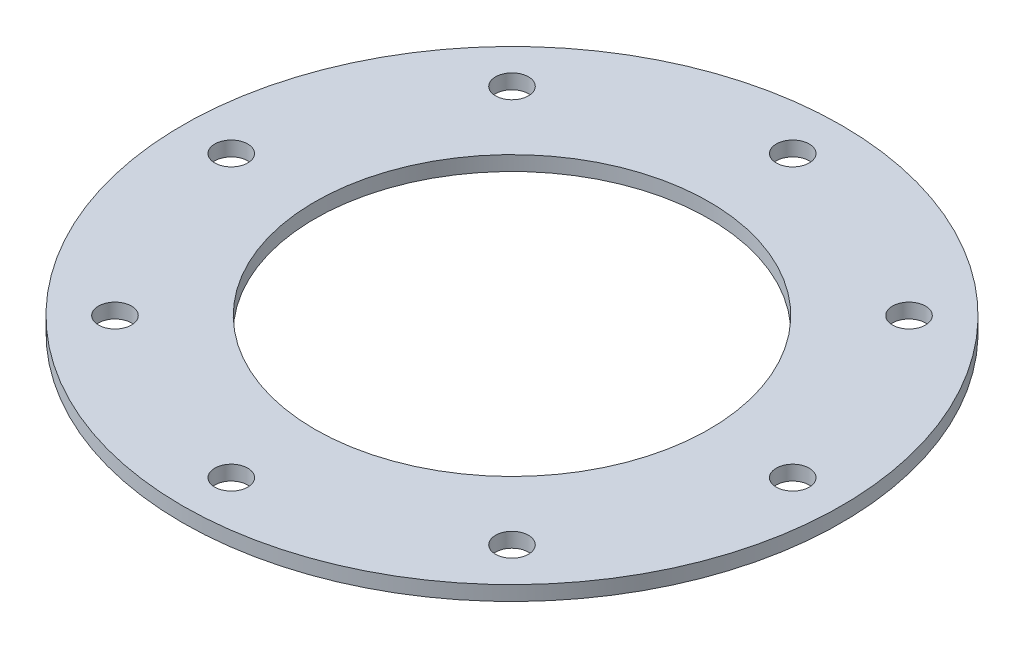
ISO-10303-21;
HEADER;
FILE_DESCRIPTION(('STEP AP214'),'2;1');
FILE_NAME('part.step','',(''),(''),'','','');
FILE_SCHEMA(('AUTOMOTIVE_DESIGN { 1 0 10303 214 1 1 1 1 }'));
ENDSEC;
DATA;
#1=APPLICATION_CONTEXT('core data for automotive mechanical design processes');
#2=APPLICATION_PROTOCOL_DEFINITION('international standard','automotive_design',2000,#1);
#3=PRODUCT_CONTEXT('',#1,'mechanical');
#4=PRODUCT('Part','Part','',(#3));
#5=PRODUCT_RELATED_PRODUCT_CATEGORY('part','',(#4));
#6=PRODUCT_DEFINITION_FORMATION('','',#4);
#7=PRODUCT_DEFINITION_CONTEXT('part definition',#1,'design');
#8=PRODUCT_DEFINITION('design','',#6,#7);
#9=PRODUCT_DEFINITION_SHAPE('','',#8);
#10=(LENGTH_UNIT() NAMED_UNIT(*) SI_UNIT(.MILLI.,.METRE.));
#11=(NAMED_UNIT(*) PLANE_ANGLE_UNIT() SI_UNIT($,.RADIAN.));
#12=(NAMED_UNIT(*) SI_UNIT($,.STERADIAN.) SOLID_ANGLE_UNIT());
#13=UNCERTAINTY_MEASURE_WITH_UNIT(LENGTH_MEASURE(1.E-05),#10,'distance_accuracy_value','');
#14=(GEOMETRIC_REPRESENTATION_CONTEXT(3) GLOBAL_UNCERTAINTY_ASSIGNED_CONTEXT((#13)) GLOBAL_UNIT_ASSIGNED_CONTEXT((#10,
#11,#12)) REPRESENTATION_CONTEXT('',''));
#15=CARTESIAN_POINT('',(0.,0.,0.));
#16=DIRECTION('',(0.,0.,1.));
#17=DIRECTION('',(1.,0.,0.));
#18=AXIS2_PLACEMENT_3D('',#15,#16,#17);
#19=CARTESIAN_POINT('',(0.,6.,0.));
#20=DIRECTION('',(0.,1.,0.));
#21=DIRECTION('',(0.,0.,1.));
#22=AXIS2_PLACEMENT_3D('',#19,#20,#21);
#23=PLANE('',#22);
#24=CARTESIAN_POINT('',(0.,6.,-115.));
#25=DIRECTION('',(0.,1.,0.));
#26=DIRECTION('',(0.,0.,1.));
#27=AXIS2_PLACEMENT_3D('',#24,#25,#26);
#28=CIRCLE('',#27,6.75);
#29=CARTESIAN_POINT('',(0.,6.,-108.25));
#30=VERTEX_POINT('',#29);
#31=EDGE_CURVE('E100',#30,#30,#28,.T.);
#32=ORIENTED_EDGE('',*,*,#31,.F.);
#33=EDGE_LOOP('',(#32));
#34=FACE_BOUND('',#33,.T.);
#35=CARTESIAN_POINT('',(81.3172798364558,6.,-81.3172798364599));
#36=DIRECTION('',(0.,1.,0.));
#37=DIRECTION('',(0.,0.,1.));
#38=AXIS2_PLACEMENT_3D('',#35,#36,#37);
#39=CIRCLE('',#38,6.75000000000001);
#40=CARTESIAN_POINT('',(81.3172798364558,6.,-74.5672798364599));
#41=VERTEX_POINT('',#40);
#42=EDGE_CURVE('E94',#41,#41,#39,.T.);
#43=ORIENTED_EDGE('',*,*,#42,.F.);
#44=EDGE_LOOP('',(#43));
#45=FACE_BOUND('',#44,.T.);
#46=CARTESIAN_POINT('',(115.00000000001,6.,-9.78436459620409E-12));
#47=DIRECTION('',(0.,1.,0.));
#48=DIRECTION('',(0.,0.,1.));
#49=AXIS2_PLACEMENT_3D('',#46,#47,#48);
#50=CIRCLE('',#49,6.75000000000001);
#51=CARTESIAN_POINT('',(115.00000000001,6.,6.74999999999022));
#52=VERTEX_POINT('',#51);
#53=EDGE_CURVE('E88',#52,#52,#50,.T.);
#54=ORIENTED_EDGE('',*,*,#53,.F.);
#55=EDGE_LOOP('',(#54));
#56=FACE_BOUND('',#55,.T.);
#57=CARTESIAN_POINT('',(81.3172798364697,6.,81.317279836446));
#58=DIRECTION('',(0.,1.,0.));
#59=DIRECTION('',(0.,0.,1.));
#60=AXIS2_PLACEMENT_3D('',#57,#58,#59);
#61=CIRCLE('',#60,6.75000000000001);
#62=CARTESIAN_POINT('',(81.3172798364697,6.,88.067279836446));
#63=VERTEX_POINT('',#62);
#64=EDGE_CURVE('E82',#63,#63,#61,.T.);
#65=ORIENTED_EDGE('',*,*,#64,.F.);
#66=EDGE_LOOP('',(#65));
#67=FACE_BOUND('',#66,.T.);
#68=CARTESIAN_POINT('',(1.95687291924082E-11,6.,115.));
#69=DIRECTION('',(0.,1.,0.));
#70=DIRECTION('',(0.,0.,1.));
#71=AXIS2_PLACEMENT_3D('',#68,#69,#70);
#72=CIRCLE('',#71,6.75);
#73=CARTESIAN_POINT('',(1.95687291924082E-11,6.,121.75));
#74=VERTEX_POINT('',#73);
#75=EDGE_CURVE('E76',#74,#74,#72,.T.);
#76=ORIENTED_EDGE('',*,*,#75,.F.);
#77=EDGE_LOOP('',(#76));
#78=FACE_BOUND('',#77,.T.);
#79=CARTESIAN_POINT('',(-81.3172798364363,6.,81.3172798364599));
#80=DIRECTION('',(0.,1.,0.));
#81=DIRECTION('',(0.,0.,1.));
#82=AXIS2_PLACEMENT_3D('',#79,#80,#81);
#83=CIRCLE('',#82,6.75000000000001);
#84=CARTESIAN_POINT('',(-81.3172798364363,6.,88.0672798364599));
#85=VERTEX_POINT('',#84);
#86=EDGE_CURVE('E70',#85,#85,#83,.T.);
#87=ORIENTED_EDGE('',*,*,#86,.F.);
#88=EDGE_LOOP('',(#87));
#89=FACE_BOUND('',#88,.T.);
#90=CARTESIAN_POINT('',(-114.99999999999,6.,9.79844803439429E-12));
#91=DIRECTION('',(0.,1.,0.));
#92=DIRECTION('',(0.,0.,1.));
#93=AXIS2_PLACEMENT_3D('',#90,#91,#92);
#94=CIRCLE('',#93,6.75000000000001);
#95=CARTESIAN_POINT('',(-114.99999999999,6.,6.7500000000098));
#96=VERTEX_POINT('',#95);
#97=EDGE_CURVE('E64',#96,#96,#94,.T.);
#98=ORIENTED_EDGE('',*,*,#97,.F.);
#99=EDGE_LOOP('',(#98));
#100=FACE_BOUND('',#99,.T.);
#101=CARTESIAN_POINT('',(-81.3172798364501,6.,-81.317279836446));
#102=DIRECTION('',(0.,1.,0.));
#103=DIRECTION('',(0.,0.,1.));
#104=AXIS2_PLACEMENT_3D('',#101,#102,#103);
#105=CIRCLE('',#104,6.75000000000001);
#106=CARTESIAN_POINT('',(-81.3172798364501,6.,-74.567279836446));
#107=VERTEX_POINT('',#106);
#108=EDGE_CURVE('E58',#107,#107,#105,.T.);
#109=ORIENTED_EDGE('',*,*,#108,.F.);
#110=EDGE_LOOP('',(#109));
#111=FACE_BOUND('',#110,.T.);
#112=CARTESIAN_POINT('',(0.,6.,0.));
#113=DIRECTION('',(0.,1.,0.));
#114=DIRECTION('',(0.,0.,1.));
#115=AXIS2_PLACEMENT_3D('',#112,#113,#114);
#116=CIRCLE('',#115,135.);
#117=CARTESIAN_POINT('',(0.,6.,135.));
#118=VERTEX_POINT('',#117);
#119=EDGE_CURVE('E10',#118,#118,#116,.T.);
#120=ORIENTED_EDGE('',*,*,#119,.T.);
#121=EDGE_LOOP('',(#120));
#122=FACE_BOUND('',#121,.T.);
#123=CARTESIAN_POINT('',(0.,6.,0.));
#124=DIRECTION('',(0.,1.,0.));
#125=DIRECTION('',(0.,0.,1.));
#126=AXIS2_PLACEMENT_3D('',#123,#124,#125);
#127=CIRCLE('',#126,80.7500000000107);
#128=CARTESIAN_POINT('',(0.,6.,80.7500000000107));
#129=VERTEX_POINT('',#128);
#130=EDGE_CURVE('E48',#129,#129,#127,.T.);
#131=ORIENTED_EDGE('',*,*,#130,.F.);
#132=EDGE_LOOP('',(#131));
#133=FACE_BOUND('',#132,.T.);
#134=ADVANCED_FACE('F37',(#34,#45,#56,#67,#78,#89,#100,#111,#122,#133),#23,.T.);
#135=CARTESIAN_POINT('',(0.,0.,0.));
#136=DIRECTION('',(0.,1.,0.));
#137=DIRECTION('',(0.,0.,1.));
#138=AXIS2_PLACEMENT_3D('',#135,#136,#137);
#139=PLANE('',#138);
#140=CARTESIAN_POINT('',(0.,0.,-115.));
#141=DIRECTION('',(0.,1.,0.));
#142=DIRECTION('',(0.,0.,1.));
#143=AXIS2_PLACEMENT_3D('',#140,#141,#142);
#144=CIRCLE('',#143,6.75);
#145=CARTESIAN_POINT('',(0.,0.,-108.25));
#146=VERTEX_POINT('',#145);
#147=EDGE_CURVE('E97',#146,#146,#144,.T.);
#148=ORIENTED_EDGE('',*,*,#147,.T.);
#149=EDGE_LOOP('',(#148));
#150=FACE_BOUND('',#149,.T.);
#151=CARTESIAN_POINT('',(81.3172798364558,0.,-81.3172798364599));
#152=DIRECTION('',(0.,1.,0.));
#153=DIRECTION('',(0.,0.,1.));
#154=AXIS2_PLACEMENT_3D('',#151,#152,#153);
#155=CIRCLE('',#154,6.74999999999999);
#156=CARTESIAN_POINT('',(81.3172798364558,0.,-74.5672798364599));
#157=VERTEX_POINT('',#156);
#158=EDGE_CURVE('E91',#157,#157,#155,.T.);
#159=ORIENTED_EDGE('',*,*,#158,.T.);
#160=EDGE_LOOP('',(#159));
#161=FACE_BOUND('',#160,.T.);
#162=CARTESIAN_POINT('',(115.00000000001,0.,-9.78436459620409E-12));
#163=DIRECTION('',(0.,1.,0.));
#164=DIRECTION('',(0.,0.,1.));
#165=AXIS2_PLACEMENT_3D('',#162,#163,#164);
#166=CIRCLE('',#165,6.75000000000001);
#167=CARTESIAN_POINT('',(115.00000000001,0.,6.74999999999022));
#168=VERTEX_POINT('',#167);
#169=EDGE_CURVE('E85',#168,#168,#166,.T.);
#170=ORIENTED_EDGE('',*,*,#169,.T.);
#171=EDGE_LOOP('',(#170));
#172=FACE_BOUND('',#171,.T.);
#173=CARTESIAN_POINT('',(81.3172798364697,0.,81.317279836446));
#174=DIRECTION('',(0.,1.,0.));
#175=DIRECTION('',(0.,0.,1.));
#176=AXIS2_PLACEMENT_3D('',#173,#174,#175);
#177=CIRCLE('',#176,6.75000000000001);
#178=CARTESIAN_POINT('',(81.3172798364697,0.,88.067279836446));
#179=VERTEX_POINT('',#178);
#180=EDGE_CURVE('E79',#179,#179,#177,.T.);
#181=ORIENTED_EDGE('',*,*,#180,.T.);
#182=EDGE_LOOP('',(#181));
#183=FACE_BOUND('',#182,.T.);
#184=CARTESIAN_POINT('',(1.95687291924082E-11,0.,115.));
#185=DIRECTION('',(0.,1.,0.));
#186=DIRECTION('',(0.,0.,1.));
#187=AXIS2_PLACEMENT_3D('',#184,#185,#186);
#188=CIRCLE('',#187,6.75);
#189=CARTESIAN_POINT('',(1.95687291924082E-11,0.,121.75));
#190=VERTEX_POINT('',#189);
#191=EDGE_CURVE('E73',#190,#190,#188,.T.);
#192=ORIENTED_EDGE('',*,*,#191,.T.);
#193=EDGE_LOOP('',(#192));
#194=FACE_BOUND('',#193,.T.);
#195=CARTESIAN_POINT('',(-81.3172798364363,0.,81.3172798364599));
#196=DIRECTION('',(0.,1.,0.));
#197=DIRECTION('',(0.,0.,1.));
#198=AXIS2_PLACEMENT_3D('',#195,#196,#197);
#199=CIRCLE('',#198,6.74999999999999);
#200=CARTESIAN_POINT('',(-81.3172798364363,0.,88.0672798364599));
#201=VERTEX_POINT('',#200);
#202=EDGE_CURVE('E67',#201,#201,#199,.T.);
#203=ORIENTED_EDGE('',*,*,#202,.T.);
#204=EDGE_LOOP('',(#203));
#205=FACE_BOUND('',#204,.T.);
#206=CARTESIAN_POINT('',(-114.99999999999,0.,9.79844803439429E-12));
#207=DIRECTION('',(0.,1.,0.));
#208=DIRECTION('',(0.,0.,1.));
#209=AXIS2_PLACEMENT_3D('',#206,#207,#208);
#210=CIRCLE('',#209,6.75000000000001);
#211=CARTESIAN_POINT('',(-114.99999999999,0.,6.7500000000098));
#212=VERTEX_POINT('',#211);
#213=EDGE_CURVE('E61',#212,#212,#210,.T.);
#214=ORIENTED_EDGE('',*,*,#213,.T.);
#215=EDGE_LOOP('',(#214));
#216=FACE_BOUND('',#215,.T.);
#217=CARTESIAN_POINT('',(-81.3172798364501,0.,-81.317279836446));
#218=DIRECTION('',(0.,1.,0.));
#219=DIRECTION('',(0.,0.,1.));
#220=AXIS2_PLACEMENT_3D('',#217,#218,#219);
#221=CIRCLE('',#220,6.75000000000001);
#222=CARTESIAN_POINT('',(-81.3172798364501,0.,-74.567279836446));
#223=VERTEX_POINT('',#222);
#224=EDGE_CURVE('E53',#223,#223,#221,.T.);
#225=ORIENTED_EDGE('',*,*,#224,.T.);
#226=EDGE_LOOP('',(#225));
#227=FACE_BOUND('',#226,.T.);
#228=CARTESIAN_POINT('',(0.,0.,0.));
#229=DIRECTION('',(0.,1.,0.));
#230=DIRECTION('',(0.,0.,1.));
#231=AXIS2_PLACEMENT_3D('',#228,#229,#230);
#232=CIRCLE('',#231,135.);
#233=CARTESIAN_POINT('',(0.,0.,135.));
#234=VERTEX_POINT('',#233);
#235=EDGE_CURVE('E41',#234,#234,#232,.T.);
#236=ORIENTED_EDGE('',*,*,#235,.F.);
#237=EDGE_LOOP('',(#236));
#238=FACE_BOUND('',#237,.T.);
#239=CARTESIAN_POINT('',(0.,0.,0.));
#240=DIRECTION('',(0.,1.,0.));
#241=DIRECTION('',(0.,0.,1.));
#242=AXIS2_PLACEMENT_3D('',#239,#240,#241);
#243=CIRCLE('',#242,80.7500000000107);
#244=CARTESIAN_POINT('',(0.,0.,80.7500000000107));
#245=VERTEX_POINT('',#244);
#246=EDGE_CURVE('E50',#245,#245,#243,.T.);
#247=ORIENTED_EDGE('',*,*,#246,.T.);
#248=EDGE_LOOP('',(#247));
#249=FACE_BOUND('',#248,.T.);
#250=ADVANCED_FACE('F108',(#150,#161,#172,#183,#194,#205,#216,#227,#238,#249),#139,.F.);
#251=CARTESIAN_POINT('',(0.,6.,0.));
#252=DIRECTION('',(0.,-1.,0.));
#253=DIRECTION('',(0.,0.,-1.));
#254=AXIS2_PLACEMENT_3D('',#251,#252,#253);
#255=CYLINDRICAL_SURFACE('',#254,135.);
#256=ORIENTED_EDGE('',*,*,#119,.F.);
#257=EDGE_LOOP('',(#256));
#258=FACE_BOUND('',#257,.T.);
#259=ORIENTED_EDGE('',*,*,#235,.T.);
#260=EDGE_LOOP('',(#259));
#261=FACE_BOUND('',#260,.T.);
#262=ADVANCED_FACE('F39',(#258,#261),#255,.T.);
#263=CARTESIAN_POINT('',(0.,6.,0.));
#264=DIRECTION('',(0.,-1.,0.));
#265=DIRECTION('',(0.,0.,-1.));
#266=AXIS2_PLACEMENT_3D('',#263,#264,#265);
#267=CYLINDRICAL_SURFACE('',#266,80.7500000000107);
#268=ORIENTED_EDGE('',*,*,#130,.T.);
#269=EDGE_LOOP('',(#268));
#270=FACE_BOUND('',#269,.T.);
#271=ORIENTED_EDGE('',*,*,#246,.F.);
#272=EDGE_LOOP('',(#271));
#273=FACE_BOUND('',#272,.T.);
#274=ADVANCED_FACE('F126',(#270,#273),#267,.F.);
#275=CARTESIAN_POINT('',(-81.3172798364501,6.,-81.317279836446));
#276=DIRECTION('',(0.,1.,0.));
#277=DIRECTION('',(0.,0.,1.));
#278=AXIS2_PLACEMENT_3D('',#275,#276,#277);
#279=CYLINDRICAL_SURFACE('',#278,6.75000000000001);
#280=ORIENTED_EDGE('',*,*,#224,.F.);
#281=EDGE_LOOP('',(#280));
#282=FACE_BOUND('',#281,.T.);
#283=ORIENTED_EDGE('',*,*,#108,.T.);
#284=EDGE_LOOP('',(#283));
#285=FACE_BOUND('',#284,.T.);
#286=ADVANCED_FACE('F129',(#282,#285),#279,.F.);
#287=CARTESIAN_POINT('',(-114.99999999999,6.,9.79844803439429E-12));
#288=DIRECTION('',(0.,1.,0.));
#289=DIRECTION('',(0.,0.,1.));
#290=AXIS2_PLACEMENT_3D('',#287,#288,#289);
#291=CYLINDRICAL_SURFACE('',#290,6.75000000000001);
#292=ORIENTED_EDGE('',*,*,#213,.F.);
#293=EDGE_LOOP('',(#292));
#294=FACE_BOUND('',#293,.T.);
#295=ORIENTED_EDGE('',*,*,#97,.T.);
#296=EDGE_LOOP('',(#295));
#297=FACE_BOUND('',#296,.T.);
#298=ADVANCED_FACE('F143',(#294,#297),#291,.F.);
#299=CARTESIAN_POINT('',(-81.3172798364363,6.,81.3172798364599));
#300=DIRECTION('',(0.,1.,0.));
#301=DIRECTION('',(0.,0.,1.));
#302=AXIS2_PLACEMENT_3D('',#299,#300,#301);
#303=CYLINDRICAL_SURFACE('',#302,6.75);
#304=ORIENTED_EDGE('',*,*,#202,.F.);
#305=EDGE_LOOP('',(#304));
#306=FACE_BOUND('',#305,.T.);
#307=ORIENTED_EDGE('',*,*,#86,.T.);
#308=EDGE_LOOP('',(#307));
#309=FACE_BOUND('',#308,.T.);
#310=ADVANCED_FACE('F147',(#306,#309),#303,.F.);
#311=CARTESIAN_POINT('',(1.95687291924082E-11,6.,115.));
#312=DIRECTION('',(0.,1.,0.));
#313=DIRECTION('',(0.,0.,1.));
#314=AXIS2_PLACEMENT_3D('',#311,#312,#313);
#315=CYLINDRICAL_SURFACE('',#314,6.75);
#316=ORIENTED_EDGE('',*,*,#191,.F.);
#317=EDGE_LOOP('',(#316));
#318=FACE_BOUND('',#317,.T.);
#319=ORIENTED_EDGE('',*,*,#75,.T.);
#320=EDGE_LOOP('',(#319));
#321=FACE_BOUND('',#320,.T.);
#322=ADVANCED_FACE('F151',(#318,#321),#315,.F.);
#323=CARTESIAN_POINT('',(81.3172798364697,6.,81.317279836446));
#324=DIRECTION('',(0.,1.,0.));
#325=DIRECTION('',(0.,0.,1.));
#326=AXIS2_PLACEMENT_3D('',#323,#324,#325);
#327=CYLINDRICAL_SURFACE('',#326,6.75000000000001);
#328=ORIENTED_EDGE('',*,*,#180,.F.);
#329=EDGE_LOOP('',(#328));
#330=FACE_BOUND('',#329,.T.);
#331=ORIENTED_EDGE('',*,*,#64,.T.);
#332=EDGE_LOOP('',(#331));
#333=FACE_BOUND('',#332,.T.);
#334=ADVANCED_FACE('F155',(#330,#333),#327,.F.);
#335=CARTESIAN_POINT('',(115.00000000001,6.,-9.78436459620409E-12));
#336=DIRECTION('',(0.,1.,0.));
#337=DIRECTION('',(0.,0.,1.));
#338=AXIS2_PLACEMENT_3D('',#335,#336,#337);
#339=CYLINDRICAL_SURFACE('',#338,6.75000000000001);
#340=ORIENTED_EDGE('',*,*,#169,.F.);
#341=EDGE_LOOP('',(#340));
#342=FACE_BOUND('',#341,.T.);
#343=ORIENTED_EDGE('',*,*,#53,.T.);
#344=EDGE_LOOP('',(#343));
#345=FACE_BOUND('',#344,.T.);
#346=ADVANCED_FACE('F159',(#342,#345),#339,.F.);
#347=CARTESIAN_POINT('',(81.3172798364558,6.,-81.3172798364599));
#348=DIRECTION('',(0.,1.,0.));
#349=DIRECTION('',(0.,0.,1.));
#350=AXIS2_PLACEMENT_3D('',#347,#348,#349);
#351=CYLINDRICAL_SURFACE('',#350,6.75);
#352=ORIENTED_EDGE('',*,*,#158,.F.);
#353=EDGE_LOOP('',(#352));
#354=FACE_BOUND('',#353,.T.);
#355=ORIENTED_EDGE('',*,*,#42,.T.);
#356=EDGE_LOOP('',(#355));
#357=FACE_BOUND('',#356,.T.);
#358=ADVANCED_FACE('F163',(#354,#357),#351,.F.);
#359=CARTESIAN_POINT('',(0.,6.,-115.));
#360=DIRECTION('',(0.,1.,0.));
#361=DIRECTION('',(0.,0.,1.));
#362=AXIS2_PLACEMENT_3D('',#359,#360,#361);
#363=CYLINDRICAL_SURFACE('',#362,6.75);
#364=ORIENTED_EDGE('',*,*,#147,.F.);
#365=EDGE_LOOP('',(#364));
#366=FACE_BOUND('',#365,.T.);
#367=ORIENTED_EDGE('',*,*,#31,.T.);
#368=EDGE_LOOP('',(#367));
#369=FACE_BOUND('',#368,.T.);
#370=ADVANCED_FACE('F104',(#366,#369),#363,.F.);
#371=CLOSED_SHELL('',(#134,#250,#262,#274,#286,#298,#310,#322,#334,#346,#358,#370));
#372=MANIFOLD_SOLID_BREP('B2',#371);
#373=ADVANCED_BREP_SHAPE_REPRESENTATION('',(#18,#372),#14);
#374=SHAPE_DEFINITION_REPRESENTATION(#9,#373);
ENDSEC;
END-ISO-10303-21;
